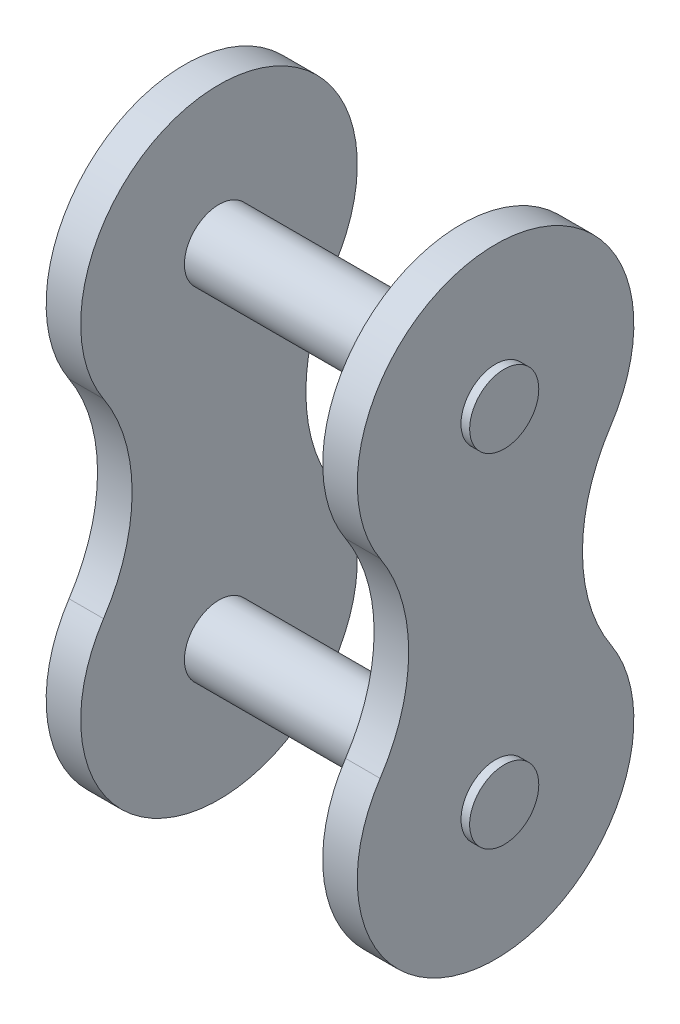
ISO-10303-21;
HEADER;
FILE_DESCRIPTION(('STEP AP214'),'2;1');
FILE_NAME('part.step','',(''),(''),'','','');
FILE_SCHEMA(('AUTOMOTIVE_DESIGN { 1 0 10303 214 1 1 1 1 }'));
ENDSEC;
DATA;
#1=APPLICATION_CONTEXT('core data for automotive mechanical design processes');
#2=APPLICATION_PROTOCOL_DEFINITION('international standard','automotive_design',2000,#1);
#3=PRODUCT_CONTEXT('',#1,'mechanical');
#4=PRODUCT('Part','Part','',(#3));
#5=PRODUCT_RELATED_PRODUCT_CATEGORY('part','',(#4));
#6=PRODUCT_DEFINITION_FORMATION('','',#4);
#7=PRODUCT_DEFINITION_CONTEXT('part definition',#1,'design');
#8=PRODUCT_DEFINITION('design','',#6,#7);
#9=PRODUCT_DEFINITION_SHAPE('','',#8);
#10=(LENGTH_UNIT() NAMED_UNIT(*) SI_UNIT(.MILLI.,.METRE.));
#11=(NAMED_UNIT(*) PLANE_ANGLE_UNIT() SI_UNIT($,.RADIAN.));
#12=(NAMED_UNIT(*) SI_UNIT($,.STERADIAN.) SOLID_ANGLE_UNIT());
#13=UNCERTAINTY_MEASURE_WITH_UNIT(LENGTH_MEASURE(1.E-05),#10,'distance_accuracy_value','');
#14=(GEOMETRIC_REPRESENTATION_CONTEXT(3) GLOBAL_UNCERTAINTY_ASSIGNED_CONTEXT((#13)) GLOBAL_UNIT_ASSIGNED_CONTEXT((#10,
#11,#12)) REPRESENTATION_CONTEXT('',''));
#15=CARTESIAN_POINT('',(0.,0.,0.));
#16=DIRECTION('',(0.,0.,1.));
#17=DIRECTION('',(1.,0.,0.));
#18=AXIS2_PLACEMENT_3D('',#15,#16,#17);
#19=CARTESIAN_POINT('',(4.75,-4.955,0.));
#20=DIRECTION('',(-1.,0.,0.));
#21=DIRECTION('',(0.,0.,1.));
#22=AXIS2_PLACEMENT_3D('',#19,#20,#21);
#23=CYLINDRICAL_SURFACE('',#22,1.);
#24=CARTESIAN_POINT('',(3.5,-4.955,0.));
#25=DIRECTION('',(1.,0.,0.));
#26=DIRECTION('',(0.,0.,-1.));
#27=AXIS2_PLACEMENT_3D('',#24,#25,#26);
#28=CIRCLE('',#27,1.);
#29=CARTESIAN_POINT('',(3.5,-4.955,-1.));
#30=VERTEX_POINT('',#29);
#31=EDGE_CURVE('E166',#30,#30,#28,.F.);
#32=ORIENTED_EDGE('',*,*,#31,.T.);
#33=EDGE_LOOP('',(#32));
#34=FACE_BOUND('',#33,.T.);
#35=CARTESIAN_POINT('',(-3.5,-4.955,0.));
#36=DIRECTION('',(-1.,0.,0.));
#37=DIRECTION('',(0.,0.,1.));
#38=AXIS2_PLACEMENT_3D('',#35,#36,#37);
#39=CIRCLE('',#38,1.);
#40=CARTESIAN_POINT('',(-3.5,-4.955,1.));
#41=VERTEX_POINT('',#40);
#42=EDGE_CURVE('E11',#41,#41,#39,.T.);
#43=ORIENTED_EDGE('',*,*,#42,.F.);
#44=EDGE_LOOP('',(#43));
#45=FACE_BOUND('',#44,.T.);
#46=ADVANCED_FACE('F43',(#34,#45),#23,.T.);
#47=CARTESIAN_POINT('',(4.5,2.4775,3.75659337032903));
#48=DIRECTION('',(1.,0.,0.));
#49=DIRECTION('',(0.,0.,-1.));
#50=AXIS2_PLACEMENT_3D('',#47,#48,#49);
#51=PLANE('',#50);
#52=CARTESIAN_POINT('',(4.5,-4.955,0.));
#53=DIRECTION('',(1.,0.,0.));
#54=DIRECTION('',(0.,0.,-1.));
#55=AXIS2_PLACEMENT_3D('',#52,#53,#54);
#56=CIRCLE('',#55,1.);
#57=CARTESIAN_POINT('',(4.5,-4.955,-1.));
#58=VERTEX_POINT('',#57);
#59=EDGE_CURVE('E180',#58,#58,#56,.T.);
#60=ORIENTED_EDGE('',*,*,#59,.F.);
#61=EDGE_LOOP('',(#60));
#62=FACE_BOUND('',#61,.T.);
#63=CARTESIAN_POINT('',(4.5,0.,7.51318674065806));
#64=DIRECTION('',(-1.,0.,0.));
#65=DIRECTION('',(0.,0.,-1.));
#66=AXIS2_PLACEMENT_3D('',#63,#64,#65);
#67=CIRCLE('',#66,5.);
#68=CARTESIAN_POINT('',(4.5,2.75277777777777,3.33919410695914));
#69=VERTEX_POINT('',#68);
#70=CARTESIAN_POINT('',(4.5,-2.75277777777778,3.33919410695914));
#71=VERTEX_POINT('',#70);
#72=EDGE_CURVE('E182',#69,#71,#67,.T.);
#73=ORIENTED_EDGE('',*,*,#72,.T.);
#74=CARTESIAN_POINT('',(4.5,-4.955,0.));
#75=DIRECTION('',(1.,0.,0.));
#76=DIRECTION('',(0.,0.,-1.));
#77=AXIS2_PLACEMENT_3D('',#74,#75,#76);
#78=CIRCLE('',#77,4.);
#79=CARTESIAN_POINT('',(4.5,-2.75277777777778,-3.33919410695914));
#80=VERTEX_POINT('',#79);
#81=EDGE_CURVE('E95',#71,#80,#78,.T.);
#82=ORIENTED_EDGE('',*,*,#81,.T.);
#83=CARTESIAN_POINT('',(4.5,0.,-7.51318674065806));
#84=DIRECTION('',(-1.,0.,0.));
#85=DIRECTION('',(0.,0.,1.));
#86=AXIS2_PLACEMENT_3D('',#83,#84,#85);
#87=CIRCLE('',#86,5.);
#88=CARTESIAN_POINT('',(4.5,2.75277777777778,-3.33919410695914));
#89=VERTEX_POINT('',#88);
#90=EDGE_CURVE('E184',#80,#89,#87,.T.);
#91=ORIENTED_EDGE('',*,*,#90,.T.);
#92=CARTESIAN_POINT('',(4.5,4.955,0.));
#93=DIRECTION('',(1.,0.,0.));
#94=DIRECTION('',(0.,0.,1.));
#95=AXIS2_PLACEMENT_3D('',#92,#93,#94);
#96=CIRCLE('',#95,4.);
#97=EDGE_CURVE('E58',#89,#69,#96,.T.);
#98=ORIENTED_EDGE('',*,*,#97,.T.);
#99=EDGE_LOOP('',(#73,#82,#91,#98));
#100=FACE_BOUND('',#99,.T.);
#101=CARTESIAN_POINT('',(4.5,4.955,0.));
#102=DIRECTION('',(1.,0.,0.));
#103=DIRECTION('',(0.,0.,1.));
#104=AXIS2_PLACEMENT_3D('',#101,#102,#103);
#105=CIRCLE('',#104,1.);
#106=CARTESIAN_POINT('',(4.5,4.955,1.00000000000001));
#107=VERTEX_POINT('',#106);
#108=EDGE_CURVE('E175',#107,#107,#105,.T.);
#109=ORIENTED_EDGE('',*,*,#108,.F.);
#110=EDGE_LOOP('',(#109));
#111=FACE_BOUND('',#110,.T.);
#112=ADVANCED_FACE('F210',(#62,#100,#111),#51,.T.);
#113=CARTESIAN_POINT('',(3.5,2.4775,3.75659337032903));
#114=DIRECTION('',(1.,0.,0.));
#115=DIRECTION('',(0.,0.,-1.));
#116=AXIS2_PLACEMENT_3D('',#113,#114,#115);
#117=PLANE('',#116);
#118=CARTESIAN_POINT('',(3.5,0.,7.51318674065806));
#119=DIRECTION('',(-1.,0.,0.));
#120=DIRECTION('',(0.,0.,-1.));
#121=AXIS2_PLACEMENT_3D('',#118,#119,#120);
#122=CIRCLE('',#121,5.);
#123=CARTESIAN_POINT('',(3.5,2.75277777777777,3.33919410695914));
#124=VERTEX_POINT('',#123);
#125=CARTESIAN_POINT('',(3.5,-2.75277777777778,3.33919410695914));
#126=VERTEX_POINT('',#125);
#127=EDGE_CURVE('E177',#124,#126,#122,.T.);
#128=ORIENTED_EDGE('',*,*,#127,.F.);
#129=CARTESIAN_POINT('',(3.5,4.955,0.));
#130=DIRECTION('',(1.,0.,0.));
#131=DIRECTION('',(0.,0.,1.));
#132=AXIS2_PLACEMENT_3D('',#129,#130,#131);
#133=CIRCLE('',#132,4.);
#134=CARTESIAN_POINT('',(3.5,2.75277777777778,-3.33919410695914));
#135=VERTEX_POINT('',#134);
#136=EDGE_CURVE('E84',#135,#124,#133,.T.);
#137=ORIENTED_EDGE('',*,*,#136,.F.);
#138=CARTESIAN_POINT('',(3.5,0.,-7.51318674065806));
#139=DIRECTION('',(-1.,0.,0.));
#140=DIRECTION('',(0.,0.,1.));
#141=AXIS2_PLACEMENT_3D('',#138,#139,#140);
#142=CIRCLE('',#141,5.);
#143=CARTESIAN_POINT('',(3.5,-2.75277777777778,-3.33919410695914));
#144=VERTEX_POINT('',#143);
#145=EDGE_CURVE('E77',#144,#135,#142,.T.);
#146=ORIENTED_EDGE('',*,*,#145,.F.);
#147=CARTESIAN_POINT('',(3.5,-4.955,0.));
#148=DIRECTION('',(1.,0.,0.));
#149=DIRECTION('',(0.,0.,-1.));
#150=AXIS2_PLACEMENT_3D('',#147,#148,#149);
#151=CIRCLE('',#150,4.);
#152=EDGE_CURVE('E186',#126,#144,#151,.T.);
#153=ORIENTED_EDGE('',*,*,#152,.F.);
#154=EDGE_LOOP('',(#128,#137,#146,#153));
#155=FACE_BOUND('',#154,.T.);
#156=ORIENTED_EDGE('',*,*,#31,.F.);
#157=EDGE_LOOP('',(#156));
#158=FACE_BOUND('',#157,.T.);
#159=CARTESIAN_POINT('',(3.5,4.955,0.));
#160=DIRECTION('',(1.,0.,0.));
#161=DIRECTION('',(0.,0.,-1.));
#162=AXIS2_PLACEMENT_3D('',#159,#160,#161);
#163=CIRCLE('',#162,1.);
#164=CARTESIAN_POINT('',(3.5,4.955,-0.999999999999993));
#165=VERTEX_POINT('',#164);
#166=EDGE_CURVE('E213',#165,#165,#163,.F.);
#167=ORIENTED_EDGE('',*,*,#166,.F.);
#168=EDGE_LOOP('',(#167));
#169=FACE_BOUND('',#168,.T.);
#170=ADVANCED_FACE('F204',(#155,#158,#169),#117,.F.);
#171=CARTESIAN_POINT('',(4.5,0.,7.51318674065806));
#172=DIRECTION('',(-1.,0.,0.));
#173=DIRECTION('',(0.,0.,1.));
#174=AXIS2_PLACEMENT_3D('',#171,#172,#173);
#175=CYLINDRICAL_SURFACE('',#174,5.);
#176=ORIENTED_EDGE('',*,*,#127,.T.);
#177=DIRECTION('',(-1.,0.,0.));
#178=VECTOR('',#177,1.);
#179=CARTESIAN_POINT('',(4.5,-2.75277777777778,3.33919410695914));
#180=LINE('',#179,#178);
#181=EDGE_CURVE('E55',#71,#126,#180,.T.);
#182=ORIENTED_EDGE('',*,*,#181,.F.);
#183=ORIENTED_EDGE('',*,*,#72,.F.);
#184=DIRECTION('',(-1.,0.,0.));
#185=VECTOR('',#184,1.);
#186=CARTESIAN_POINT('',(4.5,2.75277777777777,3.33919410695914));
#187=LINE('',#186,#185);
#188=EDGE_CURVE('E189',#69,#124,#187,.T.);
#189=ORIENTED_EDGE('',*,*,#188,.T.);
#190=EDGE_LOOP('',(#176,#182,#183,#189));
#191=FACE_BOUND('',#190,.T.);
#192=ADVANCED_FACE('F44',(#191),#175,.F.);
#193=CARTESIAN_POINT('',(4.5,-4.955,0.));
#194=DIRECTION('',(-1.,0.,0.));
#195=DIRECTION('',(0.,0.,1.));
#196=AXIS2_PLACEMENT_3D('',#193,#194,#195);
#197=CYLINDRICAL_SURFACE('',#196,4.);
#198=ORIENTED_EDGE('',*,*,#152,.T.);
#199=DIRECTION('',(-1.,0.,0.));
#200=VECTOR('',#199,1.);
#201=CARTESIAN_POINT('',(4.5,-2.75277777777778,-3.33919410695914));
#202=LINE('',#201,#200);
#203=EDGE_CURVE('E197',#80,#144,#202,.T.);
#204=ORIENTED_EDGE('',*,*,#203,.F.);
#205=ORIENTED_EDGE('',*,*,#81,.F.);
#206=ORIENTED_EDGE('',*,*,#181,.T.);
#207=EDGE_LOOP('',(#198,#204,#205,#206));
#208=FACE_BOUND('',#207,.T.);
#209=ADVANCED_FACE('F200',(#208),#197,.T.);
#210=CARTESIAN_POINT('',(4.5,0.,-7.51318674065806));
#211=DIRECTION('',(-1.,0.,0.));
#212=DIRECTION('',(0.,0.,1.));
#213=AXIS2_PLACEMENT_3D('',#210,#211,#212);
#214=CYLINDRICAL_SURFACE('',#213,5.);
#215=ORIENTED_EDGE('',*,*,#145,.T.);
#216=DIRECTION('',(-1.,0.,0.));
#217=VECTOR('',#216,1.);
#218=CARTESIAN_POINT('',(4.5,2.75277777777778,-3.33919410695914));
#219=LINE('',#218,#217);
#220=EDGE_CURVE('E192',#89,#135,#219,.T.);
#221=ORIENTED_EDGE('',*,*,#220,.F.);
#222=ORIENTED_EDGE('',*,*,#90,.F.);
#223=ORIENTED_EDGE('',*,*,#203,.T.);
#224=EDGE_LOOP('',(#215,#221,#222,#223));
#225=FACE_BOUND('',#224,.T.);
#226=ADVANCED_FACE('F267',(#225),#214,.F.);
#227=CARTESIAN_POINT('',(4.5,4.955,0.));
#228=DIRECTION('',(-1.,0.,0.));
#229=DIRECTION('',(0.,0.,1.));
#230=AXIS2_PLACEMENT_3D('',#227,#228,#229);
#231=CYLINDRICAL_SURFACE('',#230,4.);
#232=ORIENTED_EDGE('',*,*,#136,.T.);
#233=ORIENTED_EDGE('',*,*,#188,.F.);
#234=ORIENTED_EDGE('',*,*,#97,.F.);
#235=ORIENTED_EDGE('',*,*,#220,.T.);
#236=EDGE_LOOP('',(#232,#233,#234,#235));
#237=FACE_BOUND('',#236,.T.);
#238=ADVANCED_FACE('F265',(#237),#231,.T.);
#239=ORIENTED_EDGE('',*,*,#59,.T.);
#240=EDGE_LOOP('',(#239));
#241=FACE_BOUND('',#240,.T.);
#242=CARTESIAN_POINT('',(4.75,-4.955,0.));
#243=DIRECTION('',(1.,0.,0.));
#244=DIRECTION('',(0.,0.,-1.));
#245=AXIS2_PLACEMENT_3D('',#242,#243,#244);
#246=CIRCLE('',#245,1.);
#247=CARTESIAN_POINT('',(4.75,-4.955,-1.));
#248=VERTEX_POINT('',#247);
#249=EDGE_CURVE('E167',#248,#248,#246,.T.);
#250=ORIENTED_EDGE('',*,*,#249,.F.);
#251=EDGE_LOOP('',(#250));
#252=FACE_BOUND('',#251,.T.);
#253=ADVANCED_FACE('F246',(#241,#252),#23,.T.);
#254=CARTESIAN_POINT('',(4.75,-4.955,0.));
#255=DIRECTION('',(1.,0.,0.));
#256=DIRECTION('',(0.,0.,-1.));
#257=AXIS2_PLACEMENT_3D('',#254,#255,#256);
#258=PLANE('',#257);
#259=ORIENTED_EDGE('',*,*,#249,.T.);
#260=EDGE_LOOP('',(#259));
#261=FACE_BOUND('',#260,.T.);
#262=ADVANCED_FACE('F261',(#261),#258,.T.);
#263=CARTESIAN_POINT('',(-4.5,2.4775,3.75659337032903));
#264=DIRECTION('',(-1.,0.,0.));
#265=DIRECTION('',(0.,0.,-1.));
#266=AXIS2_PLACEMENT_3D('',#263,#264,#265);
#267=PLANE('',#266);
#268=CARTESIAN_POINT('',(-4.5,-4.955,0.));
#269=DIRECTION('',(1.,0.,0.));
#270=DIRECTION('',(0.,0.,-1.));
#271=AXIS2_PLACEMENT_3D('',#268,#269,#270);
#272=CIRCLE('',#271,1.);
#273=CARTESIAN_POINT('',(-4.5,-4.955,-1.));
#274=VERTEX_POINT('',#273);
#275=EDGE_CURVE('E151',#274,#274,#272,.T.);
#276=ORIENTED_EDGE('',*,*,#275,.T.);
#277=EDGE_LOOP('',(#276));
#278=FACE_BOUND('',#277,.T.);
#279=CARTESIAN_POINT('',(-4.5,0.,7.51318674065806));
#280=DIRECTION('',(-1.,0.,0.));
#281=DIRECTION('',(0.,0.,-1.));
#282=AXIS2_PLACEMENT_3D('',#279,#280,#281);
#283=CIRCLE('',#282,5.);
#284=CARTESIAN_POINT('',(-4.5,2.75277777777777,3.33919410695914));
#285=VERTEX_POINT('',#284);
#286=CARTESIAN_POINT('',(-4.5,-2.75277777777778,3.33919410695914));
#287=VERTEX_POINT('',#286);
#288=EDGE_CURVE('E136',#285,#287,#283,.T.);
#289=ORIENTED_EDGE('',*,*,#288,.F.);
#290=CARTESIAN_POINT('',(-4.5,4.955,0.));
#291=DIRECTION('',(1.,0.,0.));
#292=DIRECTION('',(0.,0.,1.));
#293=AXIS2_PLACEMENT_3D('',#290,#291,#292);
#294=CIRCLE('',#293,4.);
#295=CARTESIAN_POINT('',(-4.5,2.75277777777778,-3.33919410695914));
#296=VERTEX_POINT('',#295);
#297=EDGE_CURVE('E154',#296,#285,#294,.T.);
#298=ORIENTED_EDGE('',*,*,#297,.F.);
#299=CARTESIAN_POINT('',(-4.5,0.,-7.51318674065806));
#300=DIRECTION('',(-1.,0.,0.));
#301=DIRECTION('',(0.,0.,1.));
#302=AXIS2_PLACEMENT_3D('',#299,#300,#301);
#303=CIRCLE('',#302,5.);
#304=CARTESIAN_POINT('',(-4.5,-2.75277777777778,-3.33919410695914));
#305=VERTEX_POINT('',#304);
#306=EDGE_CURVE('E137',#305,#296,#303,.T.);
#307=ORIENTED_EDGE('',*,*,#306,.F.);
#308=CARTESIAN_POINT('',(-4.5,-4.955,0.));
#309=DIRECTION('',(1.,0.,0.));
#310=DIRECTION('',(0.,0.,-1.));
#311=AXIS2_PLACEMENT_3D('',#308,#309,#310);
#312=CIRCLE('',#311,4.);
#313=EDGE_CURVE('E125',#287,#305,#312,.T.);
#314=ORIENTED_EDGE('',*,*,#313,.F.);
#315=EDGE_LOOP('',(#289,#298,#307,#314));
#316=FACE_BOUND('',#315,.T.);
#317=CARTESIAN_POINT('',(-4.5,4.955,0.));
#318=DIRECTION('',(-1.,0.,0.));
#319=DIRECTION('',(0.,0.,1.));
#320=AXIS2_PLACEMENT_3D('',#317,#318,#319);
#321=CIRCLE('',#320,1.);
#322=CARTESIAN_POINT('',(-4.5,4.955,1.00000000000001));
#323=VERTEX_POINT('',#322);
#324=EDGE_CURVE('E216',#323,#323,#321,.F.);
#325=ORIENTED_EDGE('',*,*,#324,.T.);
#326=EDGE_LOOP('',(#325));
#327=FACE_BOUND('',#326,.T.);
#328=ADVANCED_FACE('F131',(#278,#316,#327),#267,.T.);
#329=CARTESIAN_POINT('',(-3.5,2.4775,3.75659337032903));
#330=DIRECTION('',(-1.,0.,0.));
#331=DIRECTION('',(0.,0.,-1.));
#332=AXIS2_PLACEMENT_3D('',#329,#330,#331);
#333=PLANE('',#332);
#334=CARTESIAN_POINT('',(-3.5,0.,7.51318674065806));
#335=DIRECTION('',(-1.,0.,0.));
#336=DIRECTION('',(0.,0.,-1.));
#337=AXIS2_PLACEMENT_3D('',#334,#335,#336);
#338=CIRCLE('',#337,5.);
#339=CARTESIAN_POINT('',(-3.5,2.75277777777777,3.33919410695914));
#340=VERTEX_POINT('',#339);
#341=CARTESIAN_POINT('',(-3.5,-2.75277777777778,3.33919410695914));
#342=VERTEX_POINT('',#341);
#343=EDGE_CURVE('E160',#340,#342,#338,.T.);
#344=ORIENTED_EDGE('',*,*,#343,.T.);
#345=CARTESIAN_POINT('',(-3.5,-4.955,0.));
#346=DIRECTION('',(1.,0.,0.));
#347=DIRECTION('',(0.,0.,-1.));
#348=AXIS2_PLACEMENT_3D('',#345,#346,#347);
#349=CIRCLE('',#348,4.);
#350=CARTESIAN_POINT('',(-3.5,-2.75277777777778,-3.33919410695914));
#351=VERTEX_POINT('',#350);
#352=EDGE_CURVE('E122',#342,#351,#349,.T.);
#353=ORIENTED_EDGE('',*,*,#352,.T.);
#354=CARTESIAN_POINT('',(-3.5,0.,-7.51318674065806));
#355=DIRECTION('',(-1.,0.,0.));
#356=DIRECTION('',(0.,0.,1.));
#357=AXIS2_PLACEMENT_3D('',#354,#355,#356);
#358=CIRCLE('',#357,5.);
#359=CARTESIAN_POINT('',(-3.5,2.75277777777778,-3.33919410695914));
#360=VERTEX_POINT('',#359);
#361=EDGE_CURVE('E146',#351,#360,#358,.T.);
#362=ORIENTED_EDGE('',*,*,#361,.T.);
#363=CARTESIAN_POINT('',(-3.5,4.955,0.));
#364=DIRECTION('',(1.,0.,0.));
#365=DIRECTION('',(0.,0.,1.));
#366=AXIS2_PLACEMENT_3D('',#363,#364,#365);
#367=CIRCLE('',#366,4.);
#368=EDGE_CURVE('E144',#360,#340,#367,.T.);
#369=ORIENTED_EDGE('',*,*,#368,.T.);
#370=EDGE_LOOP('',(#344,#353,#362,#369));
#371=FACE_BOUND('',#370,.T.);
#372=ORIENTED_EDGE('',*,*,#42,.T.);
#373=EDGE_LOOP('',(#372));
#374=FACE_BOUND('',#373,.T.);
#375=CARTESIAN_POINT('',(-3.5,4.955,0.));
#376=DIRECTION('',(1.,0.,0.));
#377=DIRECTION('',(0.,0.,1.));
#378=AXIS2_PLACEMENT_3D('',#375,#376,#377);
#379=CIRCLE('',#378,1.);
#380=CARTESIAN_POINT('',(-3.5,4.955,1.00000000000001));
#381=VERTEX_POINT('',#380);
#382=EDGE_CURVE('E214',#381,#381,#379,.T.);
#383=ORIENTED_EDGE('',*,*,#382,.F.);
#384=EDGE_LOOP('',(#383));
#385=FACE_BOUND('',#384,.T.);
#386=ADVANCED_FACE('F286',(#371,#374,#385),#333,.F.);
#387=CARTESIAN_POINT('',(-4.5,0.,7.51318674065806));
#388=DIRECTION('',(1.,0.,0.));
#389=DIRECTION('',(0.,0.,1.));
#390=AXIS2_PLACEMENT_3D('',#387,#388,#389);
#391=CYLINDRICAL_SURFACE('',#390,5.);
#392=ORIENTED_EDGE('',*,*,#343,.F.);
#393=DIRECTION('',(1.,0.,0.));
#394=VECTOR('',#393,1.);
#395=CARTESIAN_POINT('',(-4.5,2.75277777777777,3.33919410695914));
#396=LINE('',#395,#394);
#397=EDGE_CURVE('E141',#285,#340,#396,.T.);
#398=ORIENTED_EDGE('',*,*,#397,.F.);
#399=ORIENTED_EDGE('',*,*,#288,.T.);
#400=DIRECTION('',(1.,0.,0.));
#401=VECTOR('',#400,1.);
#402=CARTESIAN_POINT('',(-4.5,-2.75277777777778,3.33919410695914));
#403=LINE('',#402,#401);
#404=EDGE_CURVE('E120',#287,#342,#403,.T.);
#405=ORIENTED_EDGE('',*,*,#404,.T.);
#406=EDGE_LOOP('',(#392,#398,#399,#405));
#407=FACE_BOUND('',#406,.T.);
#408=ADVANCED_FACE('F142',(#407),#391,.F.);
#409=CARTESIAN_POINT('',(-4.5,-4.955,0.));
#410=DIRECTION('',(1.,0.,0.));
#411=DIRECTION('',(0.,0.,1.));
#412=AXIS2_PLACEMENT_3D('',#409,#410,#411);
#413=CYLINDRICAL_SURFACE('',#412,4.);
#414=ORIENTED_EDGE('',*,*,#352,.F.);
#415=ORIENTED_EDGE('',*,*,#404,.F.);
#416=ORIENTED_EDGE('',*,*,#313,.T.);
#417=DIRECTION('',(1.,0.,0.));
#418=VECTOR('',#417,1.);
#419=CARTESIAN_POINT('',(-4.5,-2.75277777777778,-3.33919410695914));
#420=LINE('',#419,#418);
#421=EDGE_CURVE('E133',#305,#351,#420,.T.);
#422=ORIENTED_EDGE('',*,*,#421,.T.);
#423=EDGE_LOOP('',(#414,#415,#416,#422));
#424=FACE_BOUND('',#423,.T.);
#425=ADVANCED_FACE('F123',(#424),#413,.T.);
#426=CARTESIAN_POINT('',(-4.5,0.,-7.51318674065806));
#427=DIRECTION('',(1.,0.,0.));
#428=DIRECTION('',(0.,0.,1.));
#429=AXIS2_PLACEMENT_3D('',#426,#427,#428);
#430=CYLINDRICAL_SURFACE('',#429,5.);
#431=ORIENTED_EDGE('',*,*,#361,.F.);
#432=ORIENTED_EDGE('',*,*,#421,.F.);
#433=ORIENTED_EDGE('',*,*,#306,.T.);
#434=DIRECTION('',(1.,0.,0.));
#435=VECTOR('',#434,1.);
#436=CARTESIAN_POINT('',(-4.5,2.75277777777778,-3.33919410695914));
#437=LINE('',#436,#435);
#438=EDGE_CURVE('E162',#296,#360,#437,.T.);
#439=ORIENTED_EDGE('',*,*,#438,.T.);
#440=EDGE_LOOP('',(#431,#432,#433,#439));
#441=FACE_BOUND('',#440,.T.);
#442=ADVANCED_FACE('F298',(#441),#430,.F.);
#443=CARTESIAN_POINT('',(-4.5,4.955,0.));
#444=DIRECTION('',(1.,0.,0.));
#445=DIRECTION('',(0.,0.,1.));
#446=AXIS2_PLACEMENT_3D('',#443,#444,#445);
#447=CYLINDRICAL_SURFACE('',#446,4.);
#448=ORIENTED_EDGE('',*,*,#368,.F.);
#449=ORIENTED_EDGE('',*,*,#438,.F.);
#450=ORIENTED_EDGE('',*,*,#297,.T.);
#451=ORIENTED_EDGE('',*,*,#397,.T.);
#452=EDGE_LOOP('',(#448,#449,#450,#451));
#453=FACE_BOUND('',#452,.T.);
#454=ADVANCED_FACE('F291',(#453),#447,.T.);
#455=CARTESIAN_POINT('',(-4.75,-4.955,0.));
#456=DIRECTION('',(1.,0.,0.));
#457=DIRECTION('',(0.,0.,-1.));
#458=AXIS2_PLACEMENT_3D('',#455,#456,#457);
#459=PLANE('',#458);
#460=CARTESIAN_POINT('',(-4.75,-4.955,0.));
#461=DIRECTION('',(1.,0.,0.));
#462=DIRECTION('',(0.,0.,-1.));
#463=AXIS2_PLACEMENT_3D('',#460,#461,#462);
#464=CIRCLE('',#463,1.);
#465=CARTESIAN_POINT('',(-4.75,-4.955,-1.));
#466=VERTEX_POINT('',#465);
#467=EDGE_CURVE('E128',#466,#466,#464,.T.);
#468=ORIENTED_EDGE('',*,*,#467,.F.);
#469=EDGE_LOOP('',(#468));
#470=FACE_BOUND('',#469,.T.);
#471=ADVANCED_FACE('F259',(#470),#459,.F.);
#472=ORIENTED_EDGE('',*,*,#275,.F.);
#473=EDGE_LOOP('',(#472));
#474=FACE_BOUND('',#473,.T.);
#475=ORIENTED_EDGE('',*,*,#467,.T.);
#476=EDGE_LOOP('',(#475));
#477=FACE_BOUND('',#476,.T.);
#478=ADVANCED_FACE('F244',(#474,#477),#23,.T.);
#479=CARTESIAN_POINT('',(4.75,4.955,0.));
#480=DIRECTION('',(-1.,0.,0.));
#481=DIRECTION('',(0.,0.,1.));
#482=AXIS2_PLACEMENT_3D('',#479,#480,#481);
#483=CYLINDRICAL_SURFACE('',#482,1.);
#484=ORIENTED_EDGE('',*,*,#382,.T.);
#485=EDGE_LOOP('',(#484));
#486=FACE_BOUND('',#485,.T.);
#487=ORIENTED_EDGE('',*,*,#166,.T.);
#488=EDGE_LOOP('',(#487));
#489=FACE_BOUND('',#488,.T.);
#490=ADVANCED_FACE('F231',(#486,#489),#483,.T.);
#491=CARTESIAN_POINT('',(-4.75,4.955,0.));
#492=DIRECTION('',(1.,0.,0.));
#493=DIRECTION('',(0.,0.,-1.));
#494=AXIS2_PLACEMENT_3D('',#491,#492,#493);
#495=PLANE('',#494);
#496=CARTESIAN_POINT('',(-4.75,4.955,0.));
#497=DIRECTION('',(1.,0.,0.));
#498=DIRECTION('',(0.,0.,-1.));
#499=AXIS2_PLACEMENT_3D('',#496,#497,#498);
#500=CIRCLE('',#499,1.);
#501=CARTESIAN_POINT('',(-4.75,4.955,-0.999999999999993));
#502=VERTEX_POINT('',#501);
#503=EDGE_CURVE('E219',#502,#502,#500,.T.);
#504=ORIENTED_EDGE('',*,*,#503,.F.);
#505=EDGE_LOOP('',(#504));
#506=FACE_BOUND('',#505,.T.);
#507=ADVANCED_FACE('F233',(#506),#495,.F.);
#508=ORIENTED_EDGE('',*,*,#324,.F.);
#509=EDGE_LOOP('',(#508));
#510=FACE_BOUND('',#509,.T.);
#511=ORIENTED_EDGE('',*,*,#503,.T.);
#512=EDGE_LOOP('',(#511));
#513=FACE_BOUND('',#512,.T.);
#514=ADVANCED_FACE('F230',(#510,#513),#483,.T.);
#515=ORIENTED_EDGE('',*,*,#108,.T.);
#516=EDGE_LOOP('',(#515));
#517=FACE_BOUND('',#516,.T.);
#518=CARTESIAN_POINT('',(4.75,4.955,0.));
#519=DIRECTION('',(1.,0.,0.));
#520=DIRECTION('',(0.,0.,-1.));
#521=AXIS2_PLACEMENT_3D('',#518,#519,#520);
#522=CIRCLE('',#521,1.);
#523=CARTESIAN_POINT('',(4.75,4.955,-0.999999999999993));
#524=VERTEX_POINT('',#523);
#525=EDGE_CURVE('E224',#524,#524,#522,.T.);
#526=ORIENTED_EDGE('',*,*,#525,.F.);
#527=EDGE_LOOP('',(#526));
#528=FACE_BOUND('',#527,.T.);
#529=ADVANCED_FACE('F239',(#517,#528),#483,.T.);
#530=CARTESIAN_POINT('',(4.75,4.955,0.));
#531=DIRECTION('',(1.,0.,0.));
#532=DIRECTION('',(0.,0.,-1.));
#533=AXIS2_PLACEMENT_3D('',#530,#531,#532);
#534=PLANE('',#533);
#535=ORIENTED_EDGE('',*,*,#525,.T.);
#536=EDGE_LOOP('',(#535));
#537=FACE_BOUND('',#536,.T.);
#538=ADVANCED_FACE('F276',(#537),#534,.T.);
#539=CLOSED_SHELL('',(#46,#112,#170,#192,#209,#226,#238,#253,#262,#328,#386,#408,#425,#442,#454,
#471,#478,#490,#507,#514,#529,#538));
#540=MANIFOLD_SOLID_BREP('B2',#539);
#541=ADVANCED_BREP_SHAPE_REPRESENTATION('',(#18,#540),#14);
#542=SHAPE_DEFINITION_REPRESENTATION(#9,#541);
ENDSEC;
END-ISO-10303-21;
